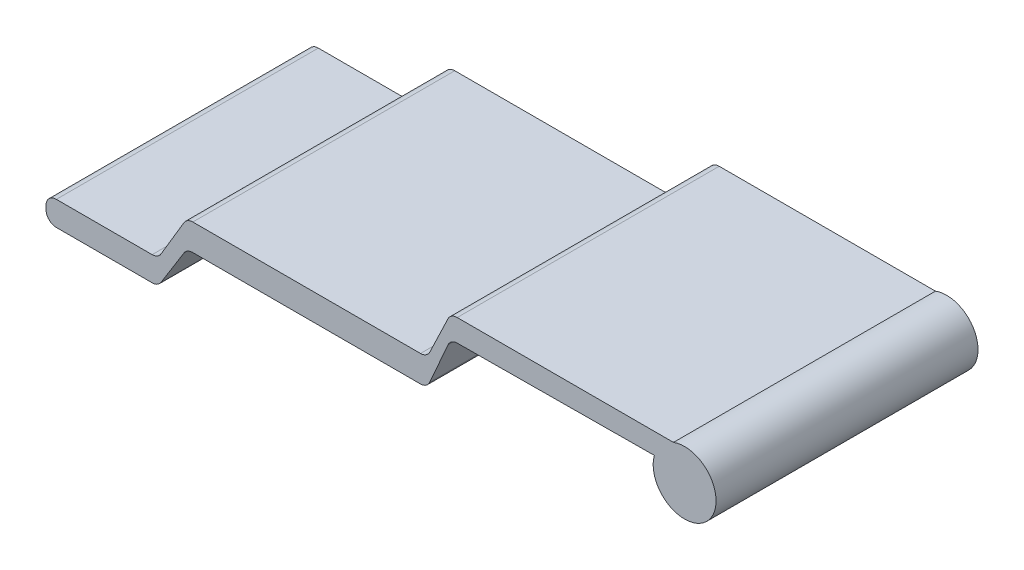
ISO-10303-21;
HEADER;
FILE_DESCRIPTION(('STEP AP214'),'2;1');
FILE_NAME('part.step','',(''),(''),'','','');
FILE_SCHEMA(('AUTOMOTIVE_DESIGN { 1 0 10303 214 1 1 1 1 }'));
ENDSEC;
DATA;
#1=APPLICATION_CONTEXT('core data for automotive mechanical design processes');
#2=APPLICATION_PROTOCOL_DEFINITION('international standard','automotive_design',2000,#1);
#3=PRODUCT_CONTEXT('',#1,'mechanical');
#4=PRODUCT('Part','Part','',(#3));
#5=PRODUCT_RELATED_PRODUCT_CATEGORY('part','',(#4));
#6=PRODUCT_DEFINITION_FORMATION('','',#4);
#7=PRODUCT_DEFINITION_CONTEXT('part definition',#1,'design');
#8=PRODUCT_DEFINITION('design','',#6,#7);
#9=PRODUCT_DEFINITION_SHAPE('','',#8);
#10=(LENGTH_UNIT() NAMED_UNIT(*) SI_UNIT(.MILLI.,.METRE.));
#11=(NAMED_UNIT(*) PLANE_ANGLE_UNIT() SI_UNIT($,.RADIAN.));
#12=(NAMED_UNIT(*) SI_UNIT($,.STERADIAN.) SOLID_ANGLE_UNIT());
#13=UNCERTAINTY_MEASURE_WITH_UNIT(LENGTH_MEASURE(1.E-05),#10,'distance_accuracy_value','');
#14=(GEOMETRIC_REPRESENTATION_CONTEXT(3) GLOBAL_UNCERTAINTY_ASSIGNED_CONTEXT((#13)) GLOBAL_UNIT_ASSIGNED_CONTEXT((#10,
#11,#12)) REPRESENTATION_CONTEXT('',''));
#15=CARTESIAN_POINT('',(0.,0.,0.));
#16=DIRECTION('',(0.,0.,1.));
#17=DIRECTION('',(1.,0.,0.));
#18=AXIS2_PLACEMENT_3D('',#15,#16,#17);
#19=CARTESIAN_POINT('',(0.,17.7621963749122,38.));
#20=DIRECTION('',(0.,1.,0.));
#21=DIRECTION('',(0.,0.,1.));
#22=AXIS2_PLACEMENT_3D('',#19,#20,#21);
#23=PLANE('',#22);
#24=DIRECTION('',(1.,0.,0.));
#25=VECTOR('',#24,1.);
#26=CARTESIAN_POINT('',(0.,17.7621963749122,0.));
#27=LINE('',#26,#25);
#28=CARTESIAN_POINT('',(59.6452396904149,17.7621963749122,0.));
#29=VERTEX_POINT('',#28);
#30=CARTESIAN_POINT('',(91.0161679623346,17.7621963749122,0.));
#31=VERTEX_POINT('',#30);
#32=EDGE_CURVE('E288',#29,#31,#27,.T.);
#33=ORIENTED_EDGE('',*,*,#32,.F.);
#34=DIRECTION('',(0.,0.,-1.));
#35=VECTOR('',#34,1.);
#36=CARTESIAN_POINT('',(59.6452396904149,17.7621963749122,38.));
#37=LINE('',#36,#35);
#38=CARTESIAN_POINT('',(59.6452396904149,17.7621963749122,38.));
#39=VERTEX_POINT('',#38);
#40=EDGE_CURVE('E118',#39,#29,#37,.T.);
#41=ORIENTED_EDGE('',*,*,#40,.F.);
#42=DIRECTION('',(1.,0.,0.));
#43=VECTOR('',#42,1.);
#44=CARTESIAN_POINT('',(0.,17.7621963749122,38.));
#45=LINE('',#44,#43);
#46=CARTESIAN_POINT('',(91.0161679623346,17.7621963749122,38.));
#47=VERTEX_POINT('',#46);
#48=EDGE_CURVE('E345',#39,#47,#45,.T.);
#49=ORIENTED_EDGE('',*,*,#48,.T.);
#50=DIRECTION('',(0.,0.,-1.));
#51=VECTOR('',#50,1.);
#52=CARTESIAN_POINT('',(91.0161679623346,17.7621963749122,38.));
#53=LINE('',#52,#51);
#54=EDGE_CURVE('E12',#47,#31,#53,.T.);
#55=ORIENTED_EDGE('',*,*,#54,.T.);
#56=EDGE_LOOP('',(#33,#41,#49,#55));
#57=FACE_BOUND('',#56,.T.);
#58=ADVANCED_FACE('F108',(#57),#23,.T.);
#59=CARTESIAN_POINT('',(59.6452396904149,16.2621963749122,38.));
#60=DIRECTION('',(0.,0.,-1.));
#61=DIRECTION('',(-1.,0.,0.));
#62=AXIS2_PLACEMENT_3D('',#59,#60,#61);
#63=CYLINDRICAL_SURFACE('',#62,1.5);
#64=CARTESIAN_POINT('',(59.6452396904149,16.2621963749122,0.));
#65=DIRECTION('',(0.,0.,1.));
#66=DIRECTION('',(1.,0.,0.));
#67=AXIS2_PLACEMENT_3D('',#64,#65,#66);
#68=CIRCLE('',#67,1.5);
#69=CARTESIAN_POINT('',(58.2918835191994,16.9090557675416,0.));
#70=VERTEX_POINT('',#69);
#71=EDGE_CURVE('E291',#29,#70,#68,.T.);
#72=ORIENTED_EDGE('',*,*,#71,.T.);
#73=DIRECTION('',(0.,0.,-1.));
#74=VECTOR('',#73,1.);
#75=CARTESIAN_POINT('',(58.2918835191994,16.9090557675416,38.));
#76=LINE('',#75,#74);
#77=CARTESIAN_POINT('',(58.2918835191994,16.9090557675416,38.));
#78=VERTEX_POINT('',#77);
#79=EDGE_CURVE('E382',#78,#70,#76,.T.);
#80=ORIENTED_EDGE('',*,*,#79,.F.);
#81=CARTESIAN_POINT('',(59.6452396904149,16.2621963749122,38.));
#82=DIRECTION('',(0.,0.,1.));
#83=DIRECTION('',(1.,0.,0.));
#84=AXIS2_PLACEMENT_3D('',#81,#82,#83);
#85=CIRCLE('',#84,1.5);
#86=EDGE_CURVE('E392',#39,#78,#85,.T.);
#87=ORIENTED_EDGE('',*,*,#86,.F.);
#88=ORIENTED_EDGE('',*,*,#40,.T.);
#89=EDGE_LOOP('',(#72,#80,#87,#88));
#90=FACE_BOUND('',#89,.T.);
#91=ADVANCED_FACE('F454',(#90),#63,.T.);
#92=CARTESIAN_POINT('',(40.8724984521946,-19.5356995345049,38.));
#93=DIRECTION('',(-0.902237447477001,0.431239595086288,0.));
#94=DIRECTION('',(-0.431239595086288,-0.902237447477001,0.));
#95=AXIS2_PLACEMENT_3D('',#92,#93,#94);
#96=PLANE('',#95);
#97=DIRECTION('',(0.431239595086288,0.902237447477001,0.));
#98=VECTOR('',#97,1.);
#99=CARTESIAN_POINT('',(40.8724984521946,-19.5356995345049,0.));
#100=LINE('',#99,#98);
#101=CARTESIAN_POINT('',(55.677790217708,11.4398620880225,0.));
#102=VERTEX_POINT('',#101);
#103=EDGE_CURVE('E295',#102,#70,#100,.T.);
#104=ORIENTED_EDGE('',*,*,#103,.F.);
#105=DIRECTION('',(0.,0.,-1.));
#106=VECTOR('',#105,1.);
#107=CARTESIAN_POINT('',(55.677790217708,11.4398620880225,38.));
#108=LINE('',#107,#106);
#109=CARTESIAN_POINT('',(55.677790217708,11.4398620880225,38.));
#110=VERTEX_POINT('',#109);
#111=EDGE_CURVE('E380',#110,#102,#108,.T.);
#112=ORIENTED_EDGE('',*,*,#111,.F.);
#113=DIRECTION('',(0.431239595086288,0.902237447477001,0.));
#114=VECTOR('',#113,1.);
#115=CARTESIAN_POINT('',(40.8724984521946,-19.5356995345049,38.));
#116=LINE('',#115,#114);
#117=EDGE_CURVE('E394',#110,#78,#116,.T.);
#118=ORIENTED_EDGE('',*,*,#117,.T.);
#119=ORIENTED_EDGE('',*,*,#79,.T.);
#120=EDGE_LOOP('',(#104,#112,#118,#119));
#121=FACE_BOUND('',#120,.T.);
#122=ADVANCED_FACE('F458',(#121),#96,.T.);
#123=CARTESIAN_POINT('',(54.3244340464925,12.086721480652,38.));
#124=DIRECTION('',(0.,0.,-1.));
#125=DIRECTION('',(-1.,0.,0.));
#126=AXIS2_PLACEMENT_3D('',#123,#124,#125);
#127=CYLINDRICAL_SURFACE('',#126,1.5);
#128=CARTESIAN_POINT('',(54.3244340464925,12.086721480652,0.));
#129=DIRECTION('',(0.,0.,1.));
#130=DIRECTION('',(1.,0.,0.));
#131=AXIS2_PLACEMENT_3D('',#128,#129,#130);
#132=CIRCLE('',#131,1.5);
#133=CARTESIAN_POINT('',(54.3244340464925,10.586721480652,0.));
#134=VERTEX_POINT('',#133);
#135=EDGE_CURVE('E298',#134,#102,#132,.T.);
#136=ORIENTED_EDGE('',*,*,#135,.F.);
#137=DIRECTION('',(0.,0.,-1.));
#138=VECTOR('',#137,1.);
#139=CARTESIAN_POINT('',(54.3244340464925,10.586721480652,38.));
#140=LINE('',#139,#138);
#141=CARTESIAN_POINT('',(54.3244340464925,10.586721480652,38.));
#142=VERTEX_POINT('',#141);
#143=EDGE_CURVE('E378',#142,#134,#140,.T.);
#144=ORIENTED_EDGE('',*,*,#143,.F.);
#145=CARTESIAN_POINT('',(54.3244340464925,12.086721480652,38.));
#146=DIRECTION('',(0.,0.,1.));
#147=DIRECTION('',(1.,0.,0.));
#148=AXIS2_PLACEMENT_3D('',#145,#146,#147);
#149=CIRCLE('',#148,1.5);
#150=EDGE_CURVE('E399',#142,#110,#149,.T.);
#151=ORIENTED_EDGE('',*,*,#150,.T.);
#152=ORIENTED_EDGE('',*,*,#111,.T.);
#153=EDGE_LOOP('',(#136,#144,#151,#152));
#154=FACE_BOUND('',#153,.T.);
#155=ADVANCED_FACE('F464',(#154),#127,.F.);
#156=CARTESIAN_POINT('',(0.,10.586721480652,38.));
#157=DIRECTION('',(0.,1.,0.));
#158=DIRECTION('',(0.,0.,1.));
#159=AXIS2_PLACEMENT_3D('',#156,#157,#158);
#160=PLANE('',#159);
#161=DIRECTION('',(1.,0.,0.));
#162=VECTOR('',#161,1.);
#163=CARTESIAN_POINT('',(0.,10.586721480652,0.));
#164=LINE('',#163,#162);
#165=CARTESIAN_POINT('',(21.2974451861733,10.586721480652,0.));
#166=VERTEX_POINT('',#165);
#167=EDGE_CURVE('E301',#166,#134,#164,.T.);
#168=ORIENTED_EDGE('',*,*,#167,.F.);
#169=DIRECTION('',(0.,0.,-1.));
#170=VECTOR('',#169,1.);
#171=CARTESIAN_POINT('',(21.2974451861733,10.586721480652,38.));
#172=LINE('',#171,#170);
#173=CARTESIAN_POINT('',(21.2974451861733,10.586721480652,38.));
#174=VERTEX_POINT('',#173);
#175=EDGE_CURVE('E376',#174,#166,#172,.T.);
#176=ORIENTED_EDGE('',*,*,#175,.F.);
#177=DIRECTION('',(1.,0.,0.));
#178=VECTOR('',#177,1.);
#179=CARTESIAN_POINT('',(0.,10.586721480652,38.));
#180=LINE('',#179,#178);
#181=EDGE_CURVE('E402',#174,#142,#180,.T.);
#182=ORIENTED_EDGE('',*,*,#181,.T.);
#183=ORIENTED_EDGE('',*,*,#143,.T.);
#184=EDGE_LOOP('',(#168,#176,#182,#183));
#185=FACE_BOUND('',#184,.T.);
#186=ADVANCED_FACE('F468',(#185),#160,.T.);
#187=CARTESIAN_POINT('',(21.2974451861733,9.08672148065196,38.));
#188=DIRECTION('',(0.,0.,-1.));
#189=DIRECTION('',(-1.,0.,0.));
#190=AXIS2_PLACEMENT_3D('',#187,#188,#189);
#191=CYLINDRICAL_SURFACE('',#190,1.5);
#192=CARTESIAN_POINT('',(21.2974451861733,9.08672148065196,0.));
#193=DIRECTION('',(0.,0.,1.));
#194=DIRECTION('',(1.,0.,0.));
#195=AXIS2_PLACEMENT_3D('',#192,#193,#194);
#196=CIRCLE('',#195,1.5);
#197=CARTESIAN_POINT('',(20.0084406242912,9.85383766445158,0.));
#198=VERTEX_POINT('',#197);
#199=EDGE_CURVE('E304',#166,#198,#196,.T.);
#200=ORIENTED_EDGE('',*,*,#199,.T.);
#201=DIRECTION('',(0.,0.,-1.));
#202=VECTOR('',#201,1.);
#203=CARTESIAN_POINT('',(20.0084406242912,9.85383766445158,38.));
#204=LINE('',#203,#202);
#205=CARTESIAN_POINT('',(20.0084406242912,9.85383766445158,38.));
#206=VERTEX_POINT('',#205);
#207=EDGE_CURVE('E374',#206,#198,#204,.T.);
#208=ORIENTED_EDGE('',*,*,#207,.F.);
#209=CARTESIAN_POINT('',(21.2974451861733,9.08672148065196,38.));
#210=DIRECTION('',(0.,0.,1.));
#211=DIRECTION('',(1.,0.,0.));
#212=AXIS2_PLACEMENT_3D('',#209,#210,#211);
#213=CIRCLE('',#212,1.5);
#214=EDGE_CURVE('E405',#174,#206,#213,.T.);
#215=ORIENTED_EDGE('',*,*,#214,.F.);
#216=ORIENTED_EDGE('',*,*,#175,.T.);
#217=EDGE_LOOP('',(#200,#208,#215,#216));
#218=FACE_BOUND('',#217,.T.);
#219=ADVANCED_FACE('F472',(#218),#191,.T.);
#220=CARTESIAN_POINT('',(10.4449087443426,-6.21600479396028,38.));
#221=DIRECTION('',(-0.859336374588024,0.511410789199749,0.));
#222=DIRECTION('',(-0.511410789199749,-0.859336374588024,0.));
#223=AXIS2_PLACEMENT_3D('',#220,#221,#222);
#224=PLANE('',#223);
#225=DIRECTION('',(0.511410789199749,0.859336374588024,0.));
#226=VECTOR('',#225,1.);
#227=CARTESIAN_POINT('',(10.4449087443426,-6.21600479396028,0.));
#228=LINE('',#227,#226);
#229=CARTESIAN_POINT('',(16.6849639348818,4.26931643490545,0.));
#230=VERTEX_POINT('',#229);
#231=EDGE_CURVE('E307',#230,#198,#228,.T.);
#232=ORIENTED_EDGE('',*,*,#231,.F.);
#233=DIRECTION('',(0.,0.,-1.));
#234=VECTOR('',#233,1.);
#235=CARTESIAN_POINT('',(16.6849639348818,4.26931643490545,38.));
#236=LINE('',#235,#234);
#237=CARTESIAN_POINT('',(16.6849639348818,4.26931643490545,38.));
#238=VERTEX_POINT('',#237);
#239=EDGE_CURVE('E372',#238,#230,#236,.T.);
#240=ORIENTED_EDGE('',*,*,#239,.F.);
#241=DIRECTION('',(0.511410789199749,0.859336374588024,0.));
#242=VECTOR('',#241,1.);
#243=CARTESIAN_POINT('',(10.4449087443426,-6.21600479396028,38.));
#244=LINE('',#243,#242);
#245=EDGE_CURVE('E407',#238,#206,#244,.T.);
#246=ORIENTED_EDGE('',*,*,#245,.T.);
#247=ORIENTED_EDGE('',*,*,#207,.T.);
#248=EDGE_LOOP('',(#232,#240,#246,#247));
#249=FACE_BOUND('',#248,.T.);
#250=ADVANCED_FACE('F476',(#249),#224,.T.);
#251=CARTESIAN_POINT('',(15.3959593729997,5.03643261870507,38.));
#252=DIRECTION('',(0.,0.,-1.));
#253=DIRECTION('',(-1.,0.,0.));
#254=AXIS2_PLACEMENT_3D('',#251,#252,#253);
#255=CYLINDRICAL_SURFACE('',#254,1.5);
#256=CARTESIAN_POINT('',(15.3959593729997,5.03643261870507,0.));
#257=DIRECTION('',(0.,0.,1.));
#258=DIRECTION('',(1.,0.,0.));
#259=AXIS2_PLACEMENT_3D('',#256,#257,#258);
#260=CIRCLE('',#259,1.5);
#261=CARTESIAN_POINT('',(15.3959593729997,3.53643261870507,0.));
#262=VERTEX_POINT('',#261);
#263=EDGE_CURVE('E310',#262,#230,#260,.T.);
#264=ORIENTED_EDGE('',*,*,#263,.F.);
#265=DIRECTION('',(0.,0.,-1.));
#266=VECTOR('',#265,1.);
#267=CARTESIAN_POINT('',(15.3959593729997,3.53643261870507,38.));
#268=LINE('',#267,#266);
#269=CARTESIAN_POINT('',(15.3959593729997,3.53643261870507,38.));
#270=VERTEX_POINT('',#269);
#271=EDGE_CURVE('E370',#270,#262,#268,.T.);
#272=ORIENTED_EDGE('',*,*,#271,.F.);
#273=CARTESIAN_POINT('',(15.3959593729997,5.03643261870507,38.));
#274=DIRECTION('',(0.,0.,1.));
#275=DIRECTION('',(1.,0.,0.));
#276=AXIS2_PLACEMENT_3D('',#273,#274,#275);
#277=CIRCLE('',#276,1.5);
#278=EDGE_CURVE('E410',#270,#238,#277,.T.);
#279=ORIENTED_EDGE('',*,*,#278,.T.);
#280=ORIENTED_EDGE('',*,*,#239,.T.);
#281=EDGE_LOOP('',(#264,#272,#279,#280));
#282=FACE_BOUND('',#281,.T.);
#283=ADVANCED_FACE('F480',(#282),#255,.F.);
#284=CARTESIAN_POINT('',(0.,3.53643261870507,38.));
#285=DIRECTION('',(0.,1.,0.));
#286=DIRECTION('',(0.,0.,1.));
#287=AXIS2_PLACEMENT_3D('',#284,#285,#286);
#288=PLANE('',#287);
#289=DIRECTION('',(1.,0.,0.));
#290=VECTOR('',#289,1.);
#291=CARTESIAN_POINT('',(0.,3.53643261870507,0.));
#292=LINE('',#291,#290);
#293=CARTESIAN_POINT('',(1.50000000000001,3.53643261870507,0.));
#294=VERTEX_POINT('',#293);
#295=EDGE_CURVE('E313',#294,#262,#292,.T.);
#296=ORIENTED_EDGE('',*,*,#295,.F.);
#297=DIRECTION('',(0.,0.,-1.));
#298=VECTOR('',#297,1.);
#299=CARTESIAN_POINT('',(1.50000000000001,3.53643261870507,38.));
#300=LINE('',#299,#298);
#301=CARTESIAN_POINT('',(1.50000000000001,3.53643261870507,38.));
#302=VERTEX_POINT('',#301);
#303=EDGE_CURVE('E368',#302,#294,#300,.T.);
#304=ORIENTED_EDGE('',*,*,#303,.F.);
#305=DIRECTION('',(1.,0.,0.));
#306=VECTOR('',#305,1.);
#307=CARTESIAN_POINT('',(0.,3.53643261870507,38.));
#308=LINE('',#307,#306);
#309=EDGE_CURVE('E413',#302,#270,#308,.T.);
#310=ORIENTED_EDGE('',*,*,#309,.T.);
#311=ORIENTED_EDGE('',*,*,#271,.T.);
#312=EDGE_LOOP('',(#296,#304,#310,#311));
#313=FACE_BOUND('',#312,.T.);
#314=ADVANCED_FACE('F484',(#313),#288,.T.);
#315=CARTESIAN_POINT('',(1.5,2.03643261870507,38.));
#316=DIRECTION('',(0.,0.,-1.));
#317=DIRECTION('',(-1.,0.,0.));
#318=AXIS2_PLACEMENT_3D('',#315,#316,#317);
#319=CYLINDRICAL_SURFACE('',#318,1.5);
#320=CARTESIAN_POINT('',(1.5,2.03643261870507,0.));
#321=DIRECTION('',(0.,0.,1.));
#322=DIRECTION('',(1.,0.,0.));
#323=AXIS2_PLACEMENT_3D('',#320,#321,#322);
#324=CIRCLE('',#323,1.5);
#325=CARTESIAN_POINT('',(0.,2.03643261870505,0.));
#326=VERTEX_POINT('',#325);
#327=EDGE_CURVE('E316',#326,#294,#324,.F.);
#328=ORIENTED_EDGE('',*,*,#327,.F.);
#329=DIRECTION('',(0.,0.,-1.));
#330=VECTOR('',#329,1.);
#331=CARTESIAN_POINT('',(0.,2.03643261870505,38.));
#332=LINE('',#331,#330);
#333=CARTESIAN_POINT('',(0.,2.03643261870505,38.));
#334=VERTEX_POINT('',#333);
#335=EDGE_CURVE('E366',#334,#326,#332,.T.);
#336=ORIENTED_EDGE('',*,*,#335,.F.);
#337=CARTESIAN_POINT('',(1.5,2.03643261870507,38.));
#338=DIRECTION('',(0.,0.,1.));
#339=DIRECTION('',(1.,0.,0.));
#340=AXIS2_PLACEMENT_3D('',#337,#338,#339);
#341=CIRCLE('',#340,1.5);
#342=EDGE_CURVE('E416',#334,#302,#341,.F.);
#343=ORIENTED_EDGE('',*,*,#342,.T.);
#344=ORIENTED_EDGE('',*,*,#303,.T.);
#345=EDGE_LOOP('',(#328,#336,#343,#344));
#346=FACE_BOUND('',#345,.T.);
#347=ADVANCED_FACE('F488',(#346),#319,.T.);
#348=CARTESIAN_POINT('',(0.,0.,38.));
#349=DIRECTION('',(-1.,0.,0.));
#350=DIRECTION('',(0.,0.,1.));
#351=AXIS2_PLACEMENT_3D('',#348,#349,#350);
#352=PLANE('',#351);
#353=DIRECTION('',(0.,1.,0.));
#354=VECTOR('',#353,1.);
#355=CARTESIAN_POINT('',(0.,0.,0.));
#356=LINE('',#355,#354);
#357=CARTESIAN_POINT('',(0.,1.50000000000001,0.));
#358=VERTEX_POINT('',#357);
#359=EDGE_CURVE('E319',#358,#326,#356,.T.);
#360=ORIENTED_EDGE('',*,*,#359,.F.);
#361=DIRECTION('',(0.,0.,-1.));
#362=VECTOR('',#361,1.);
#363=CARTESIAN_POINT('',(0.,1.50000000000001,38.));
#364=LINE('',#363,#362);
#365=CARTESIAN_POINT('',(0.,1.50000000000001,38.));
#366=VERTEX_POINT('',#365);
#367=EDGE_CURVE('E364',#366,#358,#364,.T.);
#368=ORIENTED_EDGE('',*,*,#367,.F.);
#369=DIRECTION('',(0.,1.,0.));
#370=VECTOR('',#369,1.);
#371=CARTESIAN_POINT('',(0.,0.,38.));
#372=LINE('',#371,#370);
#373=EDGE_CURVE('E419',#366,#334,#372,.T.);
#374=ORIENTED_EDGE('',*,*,#373,.T.);
#375=ORIENTED_EDGE('',*,*,#335,.T.);
#376=EDGE_LOOP('',(#360,#368,#374,#375));
#377=FACE_BOUND('',#376,.T.);
#378=ADVANCED_FACE('F492',(#377),#352,.T.);
#379=CARTESIAN_POINT('',(1.5,1.5,38.));
#380=DIRECTION('',(0.,0.,-1.));
#381=DIRECTION('',(-1.,0.,0.));
#382=AXIS2_PLACEMENT_3D('',#379,#380,#381);
#383=CYLINDRICAL_SURFACE('',#382,1.5);
#384=CARTESIAN_POINT('',(1.5,1.5,0.));
#385=DIRECTION('',(0.,0.,1.));
#386=DIRECTION('',(1.,0.,0.));
#387=AXIS2_PLACEMENT_3D('',#384,#385,#386);
#388=CIRCLE('',#387,1.5);
#389=CARTESIAN_POINT('',(1.50000000000001,0.,0.));
#390=VERTEX_POINT('',#389);
#391=EDGE_CURVE('E322',#390,#358,#388,.F.);
#392=ORIENTED_EDGE('',*,*,#391,.F.);
#393=DIRECTION('',(0.,0.,-1.));
#394=VECTOR('',#393,1.);
#395=CARTESIAN_POINT('',(1.50000000000001,0.,38.));
#396=LINE('',#395,#394);
#397=CARTESIAN_POINT('',(1.50000000000001,0.,38.));
#398=VERTEX_POINT('',#397);
#399=EDGE_CURVE('E362',#398,#390,#396,.T.);
#400=ORIENTED_EDGE('',*,*,#399,.F.);
#401=CARTESIAN_POINT('',(1.5,1.5,38.));
#402=DIRECTION('',(0.,0.,1.));
#403=DIRECTION('',(1.,0.,0.));
#404=AXIS2_PLACEMENT_3D('',#401,#402,#403);
#405=CIRCLE('',#404,1.5);
#406=EDGE_CURVE('E422',#398,#366,#405,.F.);
#407=ORIENTED_EDGE('',*,*,#406,.T.);
#408=ORIENTED_EDGE('',*,*,#367,.T.);
#409=EDGE_LOOP('',(#392,#400,#407,#408));
#410=FACE_BOUND('',#409,.T.);
#411=ADVANCED_FACE('F496',(#410),#383,.T.);
#412=CARTESIAN_POINT('',(0.,0.,38.));
#413=DIRECTION('',(0.,1.,0.));
#414=DIRECTION('',(0.,0.,1.));
#415=AXIS2_PLACEMENT_3D('',#412,#413,#414);
#416=PLANE('',#415);
#417=DIRECTION('',(1.,0.,0.));
#418=VECTOR('',#417,1.);
#419=CARTESIAN_POINT('',(0.,0.,0.));
#420=LINE('',#419,#418);
#421=CARTESIAN_POINT('',(15.4150845567207,0.,0.));
#422=VERTEX_POINT('',#421);
#423=EDGE_CURVE('E325',#390,#422,#420,.T.);
#424=ORIENTED_EDGE('',*,*,#423,.T.);
#425=DIRECTION('',(0.,0.,-1.));
#426=VECTOR('',#425,1.);
#427=CARTESIAN_POINT('',(15.4150845567207,0.,38.));
#428=LINE('',#427,#426);
#429=CARTESIAN_POINT('',(15.4150845567207,0.,38.));
#430=VERTEX_POINT('',#429);
#431=EDGE_CURVE('E359',#430,#422,#428,.T.);
#432=ORIENTED_EDGE('',*,*,#431,.F.);
#433=DIRECTION('',(1.,0.,0.));
#434=VECTOR('',#433,1.);
#435=CARTESIAN_POINT('',(0.,0.,38.));
#436=LINE('',#435,#434);
#437=EDGE_CURVE('E425',#398,#430,#436,.T.);
#438=ORIENTED_EDGE('',*,*,#437,.F.);
#439=ORIENTED_EDGE('',*,*,#399,.T.);
#440=EDGE_LOOP('',(#424,#432,#438,#439));
#441=FACE_BOUND('',#440,.T.);
#442=ADVANCED_FACE('F500',(#441),#416,.F.);
#443=CARTESIAN_POINT('',(15.4150845567207,1.5,38.));
#444=DIRECTION('',(0.,0.,-1.));
#445=DIRECTION('',(-1.,0.,0.));
#446=AXIS2_PLACEMENT_3D('',#443,#444,#445);
#447=CYLINDRICAL_SURFACE('',#446,1.5);
#448=CARTESIAN_POINT('',(15.4150845567207,1.5,0.));
#449=DIRECTION('',(0.,0.,1.));
#450=DIRECTION('',(1.,0.,0.));
#451=AXIS2_PLACEMENT_3D('',#448,#449,#450);
#452=CIRCLE('',#451,1.5);
#453=CARTESIAN_POINT('',(16.6889842745476,0.708053342124322,0.));
#454=VERTEX_POINT('',#453);
#455=EDGE_CURVE('E327',#422,#454,#452,.T.);
#456=ORIENTED_EDGE('',*,*,#455,.T.);
#457=DIRECTION('',(0.,0.,-1.));
#458=VECTOR('',#457,1.);
#459=CARTESIAN_POINT('',(16.6889842745476,0.708053342124322,38.));
#460=LINE('',#459,#458);
#461=CARTESIAN_POINT('',(16.6889842745476,0.708053342124322,38.));
#462=VERTEX_POINT('',#461);
#463=EDGE_CURVE('E356',#462,#454,#460,.T.);
#464=ORIENTED_EDGE('',*,*,#463,.F.);
#465=CARTESIAN_POINT('',(15.4150845567207,1.5,38.));
#466=DIRECTION('',(0.,0.,1.));
#467=DIRECTION('',(1.,0.,0.));
#468=AXIS2_PLACEMENT_3D('',#465,#466,#467);
#469=CIRCLE('',#468,1.5);
#470=EDGE_CURVE('E427',#430,#462,#469,.T.);
#471=ORIENTED_EDGE('',*,*,#470,.F.);
#472=ORIENTED_EDGE('',*,*,#431,.T.);
#473=EDGE_LOOP('',(#456,#464,#471,#472));
#474=FACE_BOUND('',#473,.T.);
#475=ADVANCED_FACE('F504',(#474),#447,.T.);
#476=CARTESIAN_POINT('',(11.7195104531013,-7.28568112967713,38.));
#477=DIRECTION('',(-0.849266478551287,0.527964438583789,0.));
#478=DIRECTION('',(-0.527964438583789,-0.849266478551287,0.));
#479=AXIS2_PLACEMENT_3D('',#476,#477,#478);
#480=PLANE('',#479);
#481=DIRECTION('',(0.527964438583789,0.849266478551287,0.));
#482=VECTOR('',#481,1.);
#483=CARTESIAN_POINT('',(11.7195104531013,-7.28568112967713,0.));
#484=LINE('',#483,#482);
#485=CARTESIAN_POINT('',(20.0044202846254,6.04115621680595,0.));
#486=VERTEX_POINT('',#485);
#487=EDGE_CURVE('E329',#454,#486,#484,.T.);
#488=ORIENTED_EDGE('',*,*,#487,.T.);
#489=DIRECTION('',(0.,0.,-1.));
#490=VECTOR('',#489,1.);
#491=CARTESIAN_POINT('',(20.0044202846254,6.04115621680595,38.));
#492=LINE('',#491,#490);
#493=CARTESIAN_POINT('',(20.0044202846254,6.04115621680595,38.));
#494=VERTEX_POINT('',#493);
#495=EDGE_CURVE('E354',#494,#486,#492,.T.);
#496=ORIENTED_EDGE('',*,*,#495,.F.);
#497=DIRECTION('',(0.527964438583789,0.849266478551287,0.));
#498=VECTOR('',#497,1.);
#499=CARTESIAN_POINT('',(11.7195104531013,-7.28568112967713,38.));
#500=LINE('',#499,#498);
#501=EDGE_CURVE('E429',#462,#494,#500,.T.);
#502=ORIENTED_EDGE('',*,*,#501,.F.);
#503=ORIENTED_EDGE('',*,*,#463,.T.);
#504=EDGE_LOOP('',(#488,#496,#502,#503));
#505=FACE_BOUND('',#504,.T.);
#506=ADVANCED_FACE('F508',(#505),#480,.F.);
#507=CARTESIAN_POINT('',(21.2783200024523,5.24920955893028,38.));
#508=DIRECTION('',(0.,0.,-1.));
#509=DIRECTION('',(-1.,0.,0.));
#510=AXIS2_PLACEMENT_3D('',#507,#508,#509);
#511=CYLINDRICAL_SURFACE('',#510,1.5);
#512=CARTESIAN_POINT('',(21.2783200024523,5.24920955893028,0.));
#513=DIRECTION('',(0.,0.,1.));
#514=DIRECTION('',(1.,0.,0.));
#515=AXIS2_PLACEMENT_3D('',#512,#513,#514);
#516=CIRCLE('',#515,1.5);
#517=CARTESIAN_POINT('',(21.2783200024523,6.74920955893028,0.));
#518=VERTEX_POINT('',#517);
#519=EDGE_CURVE('E332',#518,#486,#516,.T.);
#520=ORIENTED_EDGE('',*,*,#519,.F.);
#521=DIRECTION('',(0.,0.,-1.));
#522=VECTOR('',#521,1.);
#523=CARTESIAN_POINT('',(21.2783200024523,6.74920955893028,38.));
#524=LINE('',#523,#522);
#525=CARTESIAN_POINT('',(21.2783200024523,6.74920955893028,38.));
#526=VERTEX_POINT('',#525);
#527=EDGE_CURVE('E352',#526,#518,#524,.T.);
#528=ORIENTED_EDGE('',*,*,#527,.F.);
#529=CARTESIAN_POINT('',(21.2783200024523,5.24920955893028,38.));
#530=DIRECTION('',(0.,0.,1.));
#531=DIRECTION('',(1.,0.,0.));
#532=AXIS2_PLACEMENT_3D('',#529,#530,#531);
#533=CIRCLE('',#532,1.5);
#534=EDGE_CURVE('E431',#526,#494,#533,.T.);
#535=ORIENTED_EDGE('',*,*,#534,.T.);
#536=ORIENTED_EDGE('',*,*,#495,.T.);
#537=EDGE_LOOP('',(#520,#528,#535,#536));
#538=FACE_BOUND('',#537,.T.);
#539=ADVANCED_FACE('F512',(#538),#511,.F.);
#540=CARTESIAN_POINT('',(0.,6.74920955893028,38.));
#541=DIRECTION('',(0.,1.,0.));
#542=DIRECTION('',(0.,0.,1.));
#543=AXIS2_PLACEMENT_3D('',#540,#541,#542);
#544=PLANE('',#543);
#545=DIRECTION('',(1.,0.,0.));
#546=VECTOR('',#545,1.);
#547=CARTESIAN_POINT('',(0.,6.74920955893028,0.));
#548=LINE('',#547,#546);
#549=CARTESIAN_POINT('',(54.2909743959413,6.74920955893028,0.));
#550=VERTEX_POINT('',#549);
#551=EDGE_CURVE('E335',#518,#550,#548,.T.);
#552=ORIENTED_EDGE('',*,*,#551,.T.);
#553=DIRECTION('',(0.,0.,-1.));
#554=VECTOR('',#553,1.);
#555=CARTESIAN_POINT('',(54.2909743959413,6.74920955893028,38.));
#556=LINE('',#555,#554);
#557=CARTESIAN_POINT('',(54.2909743959413,6.74920955893028,38.));
#558=VERTEX_POINT('',#557);
#559=EDGE_CURVE('E349',#558,#550,#556,.T.);
#560=ORIENTED_EDGE('',*,*,#559,.F.);
#561=DIRECTION('',(1.,0.,0.));
#562=VECTOR('',#561,1.);
#563=CARTESIAN_POINT('',(0.,6.74920955893028,38.));
#564=LINE('',#563,#562);
#565=EDGE_CURVE('E434',#526,#558,#564,.T.);
#566=ORIENTED_EDGE('',*,*,#565,.F.);
#567=ORIENTED_EDGE('',*,*,#527,.T.);
#568=EDGE_LOOP('',(#552,#560,#566,#567));
#569=FACE_BOUND('',#568,.T.);
#570=ADVANCED_FACE('F439',(#569),#544,.F.);
#571=CARTESIAN_POINT('',(54.2909743959413,8.24920955893027,38.));
#572=DIRECTION('',(0.,0.,-1.));
#573=DIRECTION('',(-1.,0.,0.));
#574=AXIS2_PLACEMENT_3D('',#571,#572,#573);
#575=CYLINDRICAL_SURFACE('',#574,1.5);
#576=CARTESIAN_POINT('',(54.2909743959413,8.24920955893027,0.));
#577=DIRECTION('',(0.,0.,1.));
#578=DIRECTION('',(1.,0.,0.));
#579=AXIS2_PLACEMENT_3D('',#576,#577,#578);
#580=CIRCLE('',#579,1.5);
#581=CARTESIAN_POINT('',(55.6640953876401,7.64543912063777,0.));
#582=VERTEX_POINT('',#581);
#583=EDGE_CURVE('E337',#550,#582,#580,.T.);
#584=ORIENTED_EDGE('',*,*,#583,.T.);
#585=DIRECTION('',(0.,0.,-1.));
#586=VECTOR('',#585,1.);
#587=CARTESIAN_POINT('',(55.6640953876401,7.64543912063777,38.));
#588=LINE('',#587,#586);
#589=CARTESIAN_POINT('',(55.6640953876401,7.64543912063777,38.));
#590=VERTEX_POINT('',#589);
#591=EDGE_CURVE('E280',#590,#582,#588,.T.);
#592=ORIENTED_EDGE('',*,*,#591,.F.);
#593=CARTESIAN_POINT('',(54.2909743959413,8.24920955893027,38.));
#594=DIRECTION('',(0.,0.,1.));
#595=DIRECTION('',(1.,0.,0.));
#596=AXIS2_PLACEMENT_3D('',#593,#594,#595);
#597=CIRCLE('',#596,1.5);
#598=EDGE_CURVE('E268',#558,#590,#597,.T.);
#599=ORIENTED_EDGE('',*,*,#598,.F.);
#600=ORIENTED_EDGE('',*,*,#559,.T.);
#601=EDGE_LOOP('',(#584,#592,#599,#600));
#602=FACE_BOUND('',#601,.T.);
#603=ADVANCED_FACE('F443',(#602),#575,.T.);
#604=CARTESIAN_POINT('',(43.8284644670642,-19.2716675085036,38.));
#605=DIRECTION('',(-0.915413994465908,0.402513625528343,0.));
#606=DIRECTION('',(-0.402513625528343,-0.915413994465908,0.));
#607=AXIS2_PLACEMENT_3D('',#604,#605,#606);
#608=PLANE('',#607);
#609=DIRECTION('',(0.402513625528343,0.915413994465908,0.));
#610=VECTOR('',#609,1.);
#611=CARTESIAN_POINT('',(43.8284644670642,-19.2716675085036,0.));
#612=LINE('',#611,#610);
#613=CARTESIAN_POINT('',(58.3055783492672,13.6528145630037,0.));
#614=VERTEX_POINT('',#613);
#615=EDGE_CURVE('E277',#582,#614,#612,.T.);
#616=ORIENTED_EDGE('',*,*,#615,.T.);
#617=DIRECTION('',(0.,0.,-1.));
#618=VECTOR('',#617,1.);
#619=CARTESIAN_POINT('',(58.3055783492672,13.6528145630037,38.));
#620=LINE('',#619,#618);
#621=CARTESIAN_POINT('',(58.3055783492672,13.6528145630037,38.));
#622=VERTEX_POINT('',#621);
#623=EDGE_CURVE('E274',#622,#614,#620,.T.);
#624=ORIENTED_EDGE('',*,*,#623,.F.);
#625=DIRECTION('',(0.402513625528343,0.915413994465908,0.));
#626=VECTOR('',#625,1.);
#627=CARTESIAN_POINT('',(43.8284644670642,-19.2716675085036,38.));
#628=LINE('',#627,#626);
#629=EDGE_CURVE('E261',#590,#622,#628,.T.);
#630=ORIENTED_EDGE('',*,*,#629,.F.);
#631=ORIENTED_EDGE('',*,*,#591,.T.);
#632=EDGE_LOOP('',(#616,#624,#630,#631));
#633=FACE_BOUND('',#632,.T.);
#634=ADVANCED_FACE('F275',(#633),#608,.F.);
#635=CARTESIAN_POINT('',(59.6786993409661,13.0490441247112,38.));
#636=DIRECTION('',(0.,0.,-1.));
#637=DIRECTION('',(-1.,0.,0.));
#638=AXIS2_PLACEMENT_3D('',#635,#636,#637);
#639=CYLINDRICAL_SURFACE('',#638,1.5);
#640=CARTESIAN_POINT('',(59.6786993409661,13.0490441247112,0.));
#641=DIRECTION('',(0.,0.,1.));
#642=DIRECTION('',(1.,0.,0.));
#643=AXIS2_PLACEMENT_3D('',#640,#641,#642);
#644=CIRCLE('',#643,1.5);
#645=CARTESIAN_POINT('',(59.6786993409661,14.5490441247112,0.));
#646=VERTEX_POINT('',#645);
#647=EDGE_CURVE('E340',#646,#614,#644,.T.);
#648=ORIENTED_EDGE('',*,*,#647,.F.);
#649=DIRECTION('',(0.,0.,-1.));
#650=VECTOR('',#649,1.);
#651=CARTESIAN_POINT('',(59.6786993409661,14.5490441247112,38.));
#652=LINE('',#651,#650);
#653=CARTESIAN_POINT('',(59.6786993409661,14.5490441247112,38.));
#654=VERTEX_POINT('',#653);
#655=EDGE_CURVE('E194',#654,#646,#652,.T.);
#656=ORIENTED_EDGE('',*,*,#655,.F.);
#657=CARTESIAN_POINT('',(59.6786993409661,13.0490441247112,38.));
#658=DIRECTION('',(0.,0.,1.));
#659=DIRECTION('',(1.,0.,0.));
#660=AXIS2_PLACEMENT_3D('',#657,#658,#659);
#661=CIRCLE('',#660,1.5);
#662=EDGE_CURVE('E266',#654,#622,#661,.T.);
#663=ORIENTED_EDGE('',*,*,#662,.T.);
#664=ORIENTED_EDGE('',*,*,#623,.T.);
#665=EDGE_LOOP('',(#648,#656,#663,#664));
#666=FACE_BOUND('',#665,.T.);
#667=ADVANCED_FACE('F282',(#666),#639,.F.);
#668=CARTESIAN_POINT('',(-0.095854915557898,14.1439460836931,38.));
#669=DIRECTION('',(0.00677694285620642,-0.999977036259095,0.));
#670=DIRECTION('',(0.999977036259095,0.00677694285620642,0.));
#671=AXIS2_PLACEMENT_3D('',#668,#669,#670);
#672=PLANE('',#671);
#673=DIRECTION('',(-0.999977036259095,-0.00677694285620642,0.));
#674=VECTOR('',#673,1.);
#675=CARTESIAN_POINT('',(-0.095854915557898,14.1439460836931,0.));
#676=LINE('',#675,#674);
#677=CARTESIAN_POINT('',(88.2418326390509,14.7426192920765,0.));
#678=VERTEX_POINT('',#677);
#679=EDGE_CURVE('E342',#678,#646,#676,.T.);
#680=ORIENTED_EDGE('',*,*,#679,.F.);
#681=DIRECTION('',(0.,0.,-1.));
#682=VECTOR('',#681,1.);
#683=CARTESIAN_POINT('',(88.2418326390509,14.7426192920765,38.));
#684=LINE('',#683,#682);
#685=CARTESIAN_POINT('',(88.2418326390509,14.7426192920765,38.));
#686=VERTEX_POINT('',#685);
#687=EDGE_CURVE('E127',#686,#678,#684,.T.);
#688=ORIENTED_EDGE('',*,*,#687,.F.);
#689=DIRECTION('',(-0.999977036259095,-0.00677694285620642,0.));
#690=VECTOR('',#689,1.);
#691=CARTESIAN_POINT('',(-0.095854915557898,14.1439460836931,38.));
#692=LINE('',#691,#690);
#693=EDGE_CURVE('E283',#686,#654,#692,.T.);
#694=ORIENTED_EDGE('',*,*,#693,.T.);
#695=ORIENTED_EDGE('',*,*,#655,.T.);
#696=EDGE_LOOP('',(#680,#688,#694,#695));
#697=FACE_BOUND('',#696,.T.);
#698=ADVANCED_FACE('F444',(#697),#672,.T.);
#699=CARTESIAN_POINT('',(0.,0.,0.));
#700=DIRECTION('',(0.,0.,1.));
#701=DIRECTION('',(1.,0.,0.));
#702=AXIS2_PLACEMENT_3D('',#699,#700,#701);
#703=PLANE('',#702);
#704=ORIENTED_EDGE('',*,*,#32,.T.);
#705=CARTESIAN_POINT('',(92.6305442141596,13.4946410750785,0.));
#706=DIRECTION('',(0.,0.,1.));
#707=DIRECTION('',(1.,0.,0.));
#708=AXIS2_PLACEMENT_3D('',#705,#706,#707);
#709=CIRCLE('',#708,4.56270083608322);
#710=EDGE_CURVE('E112',#678,#31,#709,.T.);
#711=ORIENTED_EDGE('',*,*,#710,.F.);
#712=ORIENTED_EDGE('',*,*,#679,.T.);
#713=ORIENTED_EDGE('',*,*,#647,.T.);
#714=ORIENTED_EDGE('',*,*,#615,.F.);
#715=ORIENTED_EDGE('',*,*,#583,.F.);
#716=ORIENTED_EDGE('',*,*,#551,.F.);
#717=ORIENTED_EDGE('',*,*,#519,.T.);
#718=ORIENTED_EDGE('',*,*,#487,.F.);
#719=ORIENTED_EDGE('',*,*,#455,.F.);
#720=ORIENTED_EDGE('',*,*,#423,.F.);
#721=ORIENTED_EDGE('',*,*,#391,.T.);
#722=ORIENTED_EDGE('',*,*,#359,.T.);
#723=ORIENTED_EDGE('',*,*,#327,.T.);
#724=ORIENTED_EDGE('',*,*,#295,.T.);
#725=ORIENTED_EDGE('',*,*,#263,.T.);
#726=ORIENTED_EDGE('',*,*,#231,.T.);
#727=ORIENTED_EDGE('',*,*,#199,.F.);
#728=ORIENTED_EDGE('',*,*,#167,.T.);
#729=ORIENTED_EDGE('',*,*,#135,.T.);
#730=ORIENTED_EDGE('',*,*,#103,.T.);
#731=ORIENTED_EDGE('',*,*,#71,.F.);
#732=EDGE_LOOP('',(#704,#711,#712,#713,#714,#715,#716,#717,#718,#719,#720,#721,#722,#723,#724,
#725,#726,#727,#728,#729,#730,#731));
#733=FACE_BOUND('',#732,.T.);
#734=ADVANCED_FACE('F389',(#733),#703,.F.);
#735=CARTESIAN_POINT('',(0.,0.,38.));
#736=DIRECTION('',(0.,0.,1.));
#737=DIRECTION('',(1.,0.,0.));
#738=AXIS2_PLACEMENT_3D('',#735,#736,#737);
#739=PLANE('',#738);
#740=ORIENTED_EDGE('',*,*,#693,.F.);
#741=CARTESIAN_POINT('',(92.6305442141596,13.4946410750785,38.));
#742=DIRECTION('',(0.,0.,1.));
#743=DIRECTION('',(1.,0.,0.));
#744=AXIS2_PLACEMENT_3D('',#741,#742,#743);
#745=CIRCLE('',#744,4.56270083608322);
#746=EDGE_CURVE('E292',#686,#47,#745,.T.);
#747=ORIENTED_EDGE('',*,*,#746,.T.);
#748=ORIENTED_EDGE('',*,*,#48,.F.);
#749=ORIENTED_EDGE('',*,*,#86,.T.);
#750=ORIENTED_EDGE('',*,*,#117,.F.);
#751=ORIENTED_EDGE('',*,*,#150,.F.);
#752=ORIENTED_EDGE('',*,*,#181,.F.);
#753=ORIENTED_EDGE('',*,*,#214,.T.);
#754=ORIENTED_EDGE('',*,*,#245,.F.);
#755=ORIENTED_EDGE('',*,*,#278,.F.);
#756=ORIENTED_EDGE('',*,*,#309,.F.);
#757=ORIENTED_EDGE('',*,*,#342,.F.);
#758=ORIENTED_EDGE('',*,*,#373,.F.);
#759=ORIENTED_EDGE('',*,*,#406,.F.);
#760=ORIENTED_EDGE('',*,*,#437,.T.);
#761=ORIENTED_EDGE('',*,*,#470,.T.);
#762=ORIENTED_EDGE('',*,*,#501,.T.);
#763=ORIENTED_EDGE('',*,*,#534,.F.);
#764=ORIENTED_EDGE('',*,*,#565,.T.);
#765=ORIENTED_EDGE('',*,*,#598,.T.);
#766=ORIENTED_EDGE('',*,*,#629,.T.);
#767=ORIENTED_EDGE('',*,*,#662,.F.);
#768=EDGE_LOOP('',(#740,#747,#748,#749,#750,#751,#752,#753,#754,#755,#756,#757,#758,#759,#760,
#761,#762,#763,#764,#765,#766,#767));
#769=FACE_BOUND('',#768,.T.);
#770=ADVANCED_FACE('F264',(#769),#739,.T.);
#771=CARTESIAN_POINT('',(92.6305442141596,13.4946410750785,38.));
#772=DIRECTION('',(0.,0.,-1.));
#773=DIRECTION('',(-1.,0.,0.));
#774=AXIS2_PLACEMENT_3D('',#771,#772,#773);
#775=CYLINDRICAL_SURFACE('',#774,4.56270083608322);
#776=ORIENTED_EDGE('',*,*,#54,.F.);
#777=ORIENTED_EDGE('',*,*,#746,.F.);
#778=ORIENTED_EDGE('',*,*,#687,.T.);
#779=ORIENTED_EDGE('',*,*,#710,.T.);
#780=EDGE_LOOP('',(#776,#777,#778,#779));
#781=FACE_BOUND('',#780,.T.);
#782=ADVANCED_FACE('F110',(#781),#775,.T.);
#783=CLOSED_SHELL('',(#58,#91,#122,#155,#186,#219,#250,#283,#314,#347,#378,#411,#442,#475,#506,
#539,#570,#603,#634,#667,#698,#734,#770,#782));
#784=MANIFOLD_SOLID_BREP('B2',#783);
#785=ADVANCED_BREP_SHAPE_REPRESENTATION('',(#18,#784),#14);
#786=SHAPE_DEFINITION_REPRESENTATION(#9,#785);
ENDSEC;
END-ISO-10303-21;
